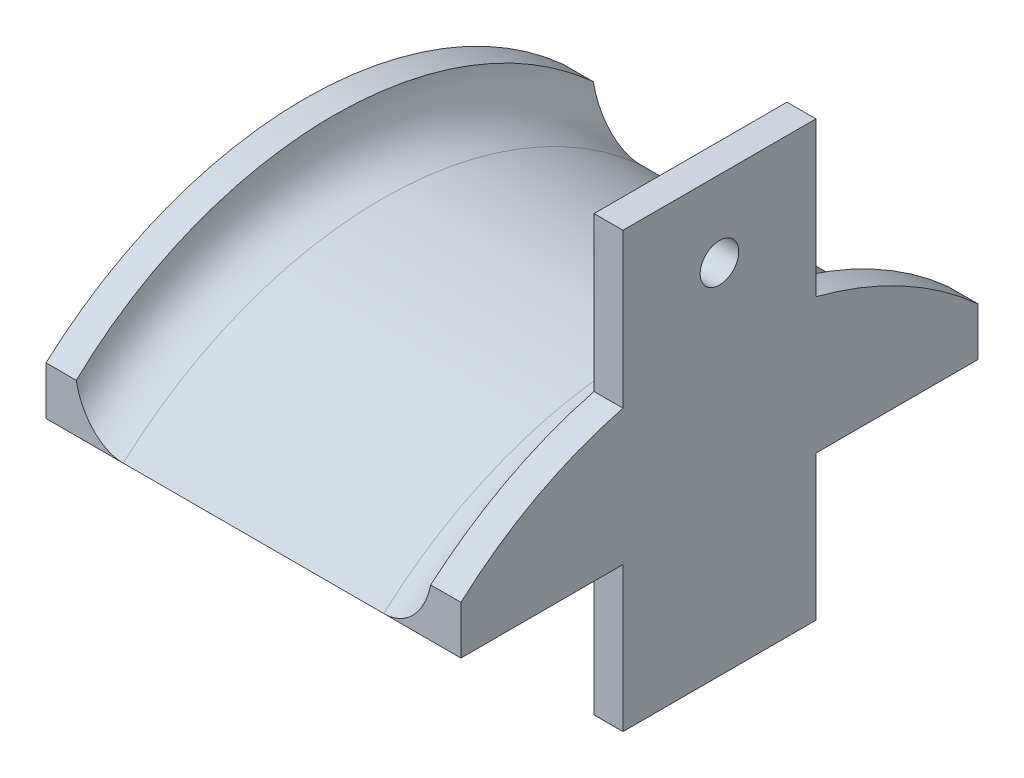
ISO-10303-21;
HEADER;
FILE_DESCRIPTION(('STEP AP214'),'2;1');
FILE_NAME('part.step','',(''),(''),'','','');
FILE_SCHEMA(('AUTOMOTIVE_DESIGN { 1 0 10303 214 1 1 1 1 }'));
ENDSEC;
DATA;
#1=APPLICATION_CONTEXT('core data for automotive mechanical design processes');
#2=APPLICATION_PROTOCOL_DEFINITION('international standard','automotive_design',2000,#1);
#3=PRODUCT_CONTEXT('',#1,'mechanical');
#4=PRODUCT('Part','Part','',(#3));
#5=PRODUCT_RELATED_PRODUCT_CATEGORY('part','',(#4));
#6=PRODUCT_DEFINITION_FORMATION('','',#4);
#7=PRODUCT_DEFINITION_CONTEXT('part definition',#1,'design');
#8=PRODUCT_DEFINITION('design','',#6,#7);
#9=PRODUCT_DEFINITION_SHAPE('','',#8);
#10=(LENGTH_UNIT() NAMED_UNIT(*) SI_UNIT(.MILLI.,.METRE.));
#11=(NAMED_UNIT(*) PLANE_ANGLE_UNIT() SI_UNIT($,.RADIAN.));
#12=(NAMED_UNIT(*) SI_UNIT($,.STERADIAN.) SOLID_ANGLE_UNIT());
#13=UNCERTAINTY_MEASURE_WITH_UNIT(LENGTH_MEASURE(1.E-05),#10,'distance_accuracy_value','');
#14=(GEOMETRIC_REPRESENTATION_CONTEXT(3) GLOBAL_UNCERTAINTY_ASSIGNED_CONTEXT((#13)) GLOBAL_UNIT_ASSIGNED_CONTEXT((#10,
#11,#12)) REPRESENTATION_CONTEXT('',''));
#15=CARTESIAN_POINT('',(0.,0.,0.));
#16=DIRECTION('',(0.,0.,1.));
#17=DIRECTION('',(1.,0.,0.));
#18=AXIS2_PLACEMENT_3D('',#15,#16,#17);
#19=CARTESIAN_POINT('',(37.,29.6991062873225,26.7948331910153));
#20=DIRECTION('',(0.,1.,0.));
#21=DIRECTION('',(0.,0.,1.));
#22=AXIS2_PLACEMENT_3D('',#19,#20,#21);
#23=PLANE('',#22);
#24=DIRECTION('',(-1.,0.,0.));
#25=VECTOR('',#24,1.);
#26=CARTESIAN_POINT('',(18.5,29.6991062873225,-3.));
#27=LINE('',#26,#25);
#28=CARTESIAN_POINT('',(37.,29.6991062873225,-3.));
#29=VERTEX_POINT('',#28);
#30=CARTESIAN_POINT('',(18.5,29.6991062873225,-3.));
#31=VERTEX_POINT('',#30);
#32=EDGE_CURVE('E229',#29,#31,#27,.T.);
#33=ORIENTED_EDGE('',*,*,#32,.T.);
#34=DIRECTION('',(0.,0.,1.));
#35=VECTOR('',#34,1.);
#36=CARTESIAN_POINT('',(18.5,29.6991062873225,-3.));
#37=LINE('',#36,#35);
#38=CARTESIAN_POINT('',(18.5,29.6991062873225,3.));
#39=VERTEX_POINT('',#38);
#40=EDGE_CURVE('E232',#31,#39,#37,.T.);
#41=ORIENTED_EDGE('',*,*,#40,.T.);
#42=DIRECTION('',(-1.,0.,0.));
#43=VECTOR('',#42,1.);
#44=CARTESIAN_POINT('',(18.5,29.6991062873225,3.));
#45=LINE('',#44,#43);
#46=CARTESIAN_POINT('',(37.,29.6991062873225,3.));
#47=VERTEX_POINT('',#46);
#48=EDGE_CURVE('E475',#47,#39,#45,.T.);
#49=ORIENTED_EDGE('',*,*,#48,.F.);
#50=DIRECTION('',(0.,0.,-1.));
#51=VECTOR('',#50,1.);
#52=CARTESIAN_POINT('',(37.,29.6991062873225,26.7948331910153));
#53=LINE('',#52,#51);
#54=CARTESIAN_POINT('',(37.,29.6991062873225,9.99999999999661));
#55=VERTEX_POINT('',#54);
#56=EDGE_CURVE('E346',#55,#47,#53,.T.);
#57=ORIENTED_EDGE('',*,*,#56,.F.);
#58=DIRECTION('',(-1.,0.,0.));
#59=VECTOR('',#58,1.);
#60=CARTESIAN_POINT('',(40.,29.6991062873225,9.99999999999661));
#61=LINE('',#60,#59);
#62=CARTESIAN_POINT('',(40.,29.6991062873225,9.99999999999661));
#63=VERTEX_POINT('',#62);
#64=EDGE_CURVE('E319',#63,#55,#61,.T.);
#65=ORIENTED_EDGE('',*,*,#64,.F.);
#66=DIRECTION('',(0.,0.,-1.));
#67=VECTOR('',#66,1.);
#68=CARTESIAN_POINT('',(40.,29.6991062873225,26.7948331910153));
#69=LINE('',#68,#67);
#70=CARTESIAN_POINT('',(40.,29.6991062873225,26.7948331910153));
#71=VERTEX_POINT('',#70);
#72=EDGE_CURVE('E252',#71,#63,#69,.T.);
#73=ORIENTED_EDGE('',*,*,#72,.F.);
#74=DIRECTION('',(-1.,0.,0.));
#75=VECTOR('',#74,1.);
#76=CARTESIAN_POINT('',(40.,29.6991062873225,26.7948331910153));
#77=LINE('',#76,#75);
#78=CARTESIAN_POINT('',(32.,29.6991062873225,26.7948331910153));
#79=VERTEX_POINT('',#78);
#80=EDGE_CURVE('E125',#71,#79,#77,.T.);
#81=ORIENTED_EDGE('',*,*,#80,.T.);
#82=DIRECTION('',(-1.,0.,0.));
#83=VECTOR('',#82,1.);
#84=CARTESIAN_POINT('',(37.,29.6991062873225,26.7948331910153));
#85=LINE('',#84,#83);
#86=CARTESIAN_POINT('',(5.,29.6991062873225,26.7948331910153));
#87=VERTEX_POINT('',#86);
#88=EDGE_CURVE('E399',#79,#87,#85,.T.);
#89=ORIENTED_EDGE('',*,*,#88,.T.);
#90=DIRECTION('',(1.,0.,0.));
#91=VECTOR('',#90,1.);
#92=CARTESIAN_POINT('',(-3.,29.6991062873225,26.7948331910153));
#93=LINE('',#92,#91);
#94=CARTESIAN_POINT('',(-3.,29.6991062873225,26.7948331910153));
#95=VERTEX_POINT('',#94);
#96=EDGE_CURVE('E338',#95,#87,#93,.T.);
#97=ORIENTED_EDGE('',*,*,#96,.F.);
#98=DIRECTION('',(0.,0.,1.));
#99=VECTOR('',#98,1.);
#100=CARTESIAN_POINT('',(-3.,29.6991062873225,-26.7948331910151));
#101=LINE('',#100,#99);
#102=CARTESIAN_POINT('',(-3.,29.6991062873225,-26.7948331910151));
#103=VERTEX_POINT('',#102);
#104=EDGE_CURVE('E320',#103,#95,#101,.T.);
#105=ORIENTED_EDGE('',*,*,#104,.F.);
#106=DIRECTION('',(1.,0.,0.));
#107=VECTOR('',#106,1.);
#108=CARTESIAN_POINT('',(-3.,29.6991062873225,-26.7948331910151));
#109=LINE('',#108,#107);
#110=CARTESIAN_POINT('',(5.,29.6991062873225,-26.7948331910151));
#111=VERTEX_POINT('',#110);
#112=EDGE_CURVE('E332',#103,#111,#109,.T.);
#113=ORIENTED_EDGE('',*,*,#112,.T.);
#114=DIRECTION('',(-1.,0.,0.));
#115=VECTOR('',#114,1.);
#116=CARTESIAN_POINT('',(37.,29.6991062873225,-26.7948331910151));
#117=LINE('',#116,#115);
#118=CARTESIAN_POINT('',(32.,29.6991062873225,-26.7948331910151));
#119=VERTEX_POINT('',#118);
#120=EDGE_CURVE('E342',#119,#111,#117,.T.);
#121=ORIENTED_EDGE('',*,*,#120,.F.);
#122=DIRECTION('',(-1.,0.,0.));
#123=VECTOR('',#122,1.);
#124=CARTESIAN_POINT('',(40.,29.6991062873225,-26.7948331910151));
#125=LINE('',#124,#123);
#126=CARTESIAN_POINT('',(40.,29.6991062873225,-26.7948331910151));
#127=VERTEX_POINT('',#126);
#128=EDGE_CURVE('E83',#127,#119,#125,.T.);
#129=ORIENTED_EDGE('',*,*,#128,.F.);
#130=DIRECTION('',(0.,0.,-1.));
#131=VECTOR('',#130,1.);
#132=CARTESIAN_POINT('',(40.,29.6991062873225,-9.9999999999964));
#133=LINE('',#132,#131);
#134=CARTESIAN_POINT('',(40.,29.6991062873225,-9.9999999999964));
#135=VERTEX_POINT('',#134);
#136=EDGE_CURVE('E265',#135,#127,#133,.T.);
#137=ORIENTED_EDGE('',*,*,#136,.F.);
#138=DIRECTION('',(-1.,0.,0.));
#139=VECTOR('',#138,1.);
#140=CARTESIAN_POINT('',(40.,29.6991062873225,-9.9999999999964));
#141=LINE('',#140,#139);
#142=CARTESIAN_POINT('',(37.,29.6991062873225,-9.99999999999646));
#143=VERTEX_POINT('',#142);
#144=EDGE_CURVE('E312',#135,#143,#141,.T.);
#145=ORIENTED_EDGE('',*,*,#144,.T.);
#146=EDGE_CURVE('E236',#29,#143,#53,.T.);
#147=ORIENTED_EDGE('',*,*,#146,.F.);
#148=EDGE_LOOP('',(#33,#41,#49,#57,#65,#73,#81,#89,#97,#105,#113,#121,#129,#137,#145,#147));
#149=FACE_BOUND('',#148,.T.);
#150=ADVANCED_FACE('F32',(#149),#23,.F.);
#151=CARTESIAN_POINT('',(37.,5.,0.));
#152=DIRECTION('',(1.,0.,0.));
#153=DIRECTION('',(0.,0.,-1.));
#154=AXIS2_PLACEMENT_3D('',#151,#152,#153);
#155=PLANE('',#154);
#156=DIRECTION('',(0.,1.,0.));
#157=VECTOR('',#156,1.);
#158=CARTESIAN_POINT('',(37.,29.6991062873225,-3.));
#159=LINE('',#158,#157);
#160=CARTESIAN_POINT('',(37.,14.6991062873225,-3.));
#161=VERTEX_POINT('',#160);
#162=EDGE_CURVE('E241',#161,#29,#159,.T.);
#163=ORIENTED_EDGE('',*,*,#162,.T.);
#164=ORIENTED_EDGE('',*,*,#146,.T.);
#165=DIRECTION('',(0.,1.,0.));
#166=VECTOR('',#165,1.);
#167=CARTESIAN_POINT('',(37.,29.6991062873225,-9.9999999999964));
#168=LINE('',#167,#166);
#169=CARTESIAN_POINT('',(37.,14.6991062873225,-9.9999999999965));
#170=VERTEX_POINT('',#169);
#171=EDGE_CURVE('E290',#170,#143,#168,.T.);
#172=ORIENTED_EDGE('',*,*,#171,.F.);
#173=DIRECTION('',(0.,0.,-1.));
#174=VECTOR('',#173,1.);
#175=CARTESIAN_POINT('',(37.,14.6991062873225,9.99999999999661));
#176=LINE('',#175,#174);
#177=EDGE_CURVE('E291',#161,#170,#176,.T.);
#178=ORIENTED_EDGE('',*,*,#177,.F.);
#179=EDGE_LOOP('',(#163,#164,#172,#178));
#180=FACE_BOUND('',#179,.T.);
#181=ADVANCED_FACE('F217',(#180),#155,.F.);
#182=CARTESIAN_POINT('',(37.,0.,0.));
#183=DIRECTION('',(-1.,0.,0.));
#184=DIRECTION('',(0.,0.,1.));
#185=AXIS2_PLACEMENT_3D('',#182,#183,#184);
#186=CYLINDRICAL_SURFACE('',#185,40.0000000000001);
#187=ORIENTED_EDGE('',*,*,#120,.T.);
#188=CARTESIAN_POINT('',(5.,0.,0.));
#189=DIRECTION('',(-1.,0.,0.));
#190=DIRECTION('',(0.,0.,1.));
#191=AXIS2_PLACEMENT_3D('',#188,#189,#190);
#192=CIRCLE('',#191,40.0000000000001);
#193=EDGE_CURVE('E406',#111,#87,#192,.F.);
#194=ORIENTED_EDGE('',*,*,#193,.T.);
#195=ORIENTED_EDGE('',*,*,#88,.F.);
#196=CARTESIAN_POINT('',(32.,0.,0.));
#197=DIRECTION('',(1.,0.,0.));
#198=DIRECTION('',(0.,0.,-1.));
#199=AXIS2_PLACEMENT_3D('',#196,#197,#198);
#200=CIRCLE('',#199,40.0000000000001);
#201=EDGE_CURVE('E132',#79,#119,#200,.F.);
#202=ORIENTED_EDGE('',*,*,#201,.T.);
#203=EDGE_LOOP('',(#187,#194,#195,#202));
#204=FACE_BOUND('',#203,.T.);
#205=ADVANCED_FACE('F191',(#204),#186,.T.);
#206=CARTESIAN_POINT('',(-3.,29.6991062873225,26.7948331910153));
#207=DIRECTION('',(0.,0.,-1.));
#208=DIRECTION('',(-1.,0.,0.));
#209=AXIS2_PLACEMENT_3D('',#206,#207,#208);
#210=PLANE('',#209);
#211=ORIENTED_EDGE('',*,*,#96,.T.);
#212=CARTESIAN_POINT('',(5.,29.6991062873225,26.7948331910153));
#213=CARTESIAN_POINT('',(4.883608827279,29.699065144692,26.7948331910153));
#214=CARTESIAN_POINT('',(4.76723671339743,29.704578128879,26.7948331910153));
#215=CARTESIAN_POINT('',(4.53559413910091,29.7264015282942,26.7948331910153));
#216=CARTESIAN_POINT('',(4.42032291824739,29.7427038463364,26.7948331910153));
#217=CARTESIAN_POINT('',(4.19268571822621,29.7856229590139,26.7948331910153));
#218=CARTESIAN_POINT('',(4.08030384430398,29.8121558927056,26.7948331910153));
#219=CARTESIAN_POINT('',(3.85830574869846,29.8750072741677,26.7948331910153));
#220=CARTESIAN_POINT('',(3.74868991286835,29.9113270790114,26.7948331910153));
#221=CARTESIAN_POINT('',(3.53325649871711,29.9929782472657,26.7948331910153));
#222=CARTESIAN_POINT('',(3.42742842586452,30.0382819952286,26.7948331910153));
#223=CARTESIAN_POINT('',(3.21973871615944,30.137252256486,26.7948331910153));
#224=CARTESIAN_POINT('',(3.11787862346508,30.1909219855975,26.7948331910153));
#225=CARTESIAN_POINT('',(2.81861121944211,30.3635318057687,26.7948331910153));
#226=CARTESIAN_POINT('',(2.62776184707359,30.4939771506646,26.7948331910153));
#227=CARTESIAN_POINT('',(2.19717036265739,30.8337015452245,26.7948331910153));
#228=CARTESIAN_POINT('',(1.96627600665766,31.0541287262231,26.7948331910153));
#229=CARTESIAN_POINT('',(1.54301489497937,31.5294801875637,26.7948331910153));
#230=CARTESIAN_POINT('',(1.35073164028924,31.7844772775766,26.7948331910153));
#231=CARTESIAN_POINT('',(0.957538397866947,32.3921846894286,26.7948331910153));
#232=CARTESIAN_POINT('',(0.768548306610147,32.7525899784403,26.7948331910153));
#233=CARTESIAN_POINT('',(0.452230658854511,33.4986489004537,26.7948331910153));
#234=CARTESIAN_POINT('',(0.324818607885212,33.884267107355,26.7948331910153));
#235=CARTESIAN_POINT('',(0.193572322569176,34.416915500635,26.7948331910153));
#236=CARTESIAN_POINT('',(0.162993538860503,34.5576844509203,26.7948331910153));
#237=CARTESIAN_POINT('',(0.136297432508185,34.6991062873224,26.7948331910153));
#238=B_SPLINE_CURVE_WITH_KNOTS('',3,(#212,#213,#214,#215,#216,#217,#218,#219,#220,#221,#222,
#223,#224,#225,#226,#227,#228,#229,#230,#231,#232,#233,#234,#235,#236,#237),.UNSPECIFIED.,.F.,
.F.,(4,2,2,2,2,2,2,2,2,2,2,2,4),(0.,0.349012948225263,0.697764265564161,1.04371562066314,
1.38971497099414,1.73466680620642,2.0797515666588,2.77070121334702,3.72326309347063,
4.67786332391619,5.89251713906917,7.10549949815716,7.53740503174517),.UNSPECIFIED.);
#239=CARTESIAN_POINT('',(0.136297432508184,34.6991062873224,26.7948331910152));
#240=VERTEX_POINT('',#239);
#241=EDGE_CURVE('E196',#87,#240,#238,.T.);
#242=ORIENTED_EDGE('',*,*,#241,.T.);
#243=DIRECTION('',(1.,0.,0.));
#244=VECTOR('',#243,1.);
#245=CARTESIAN_POINT('',(-3.,34.6991062873224,26.7948331910152));
#246=LINE('',#245,#244);
#247=CARTESIAN_POINT('',(-3.,34.6991062873224,26.7948331910152));
#248=VERTEX_POINT('',#247);
#249=EDGE_CURVE('E336',#248,#240,#246,.T.);
#250=ORIENTED_EDGE('',*,*,#249,.F.);
#251=DIRECTION('',(0.,1.,0.));
#252=VECTOR('',#251,1.);
#253=CARTESIAN_POINT('',(-3.,29.6991062873225,26.7948331910153));
#254=LINE('',#253,#252);
#255=EDGE_CURVE('E323',#95,#248,#254,.T.);
#256=ORIENTED_EDGE('',*,*,#255,.F.);
#257=EDGE_LOOP('',(#211,#242,#250,#256));
#258=FACE_BOUND('',#257,.T.);
#259=ADVANCED_FACE('F210',(#258),#210,.F.);
#260=CARTESIAN_POINT('',(-3.,5.,0.));
#261=DIRECTION('',(1.,0.,0.));
#262=DIRECTION('',(0.,0.,-1.));
#263=AXIS2_PLACEMENT_3D('',#260,#261,#262);
#264=CYLINDRICAL_SURFACE('',#263,40.0000000000001);
#265=CARTESIAN_POINT('',(0.136297432508184,34.6991062873224,26.7948331910153));
#266=CARTESIAN_POINT('',(0.120981691424066,35.2627875997258,26.1701108468965));
#267=CARTESIAN_POINT('',(0.107563574766574,35.8067161177527,25.5275366555413));
#268=CARTESIAN_POINT('',(0.0839633679317195,36.8529351001697,24.2094526936563));
#269=CARTESIAN_POINT('',(0.0737807560068713,37.3552322682365,23.533948253641));
#270=CARTESIAN_POINT('',(0.0560710237777471,38.3171481362605,22.1512622104354));
#271=CARTESIAN_POINT('',(0.0485489625995903,38.7766843155595,21.444023108501));
#272=CARTESIAN_POINT('',(0.0356856104183543,39.6502114316604,20.0018444592444));
#273=CARTESIAN_POINT('',(0.0303446400247021,40.0641956660252,19.2669008568305));
#274=CARTESIAN_POINT('',(0.0198885889012127,40.975293680572,17.5226354998639));
#275=CARTESIAN_POINT('',(0.015444299561232,41.454014419151,16.5036318131745));
#276=CARTESIAN_POINT('',(0.00866725032493233,42.32397956311,14.4286749898395));
#277=CARTESIAN_POINT('',(0.0063350739298912,42.715199772758,13.3727117262181));
#278=CARTESIAN_POINT('',(0.00299667393343831,43.4069206467483,11.2326288280633));
#279=CARTESIAN_POINT('',(0.00198917385492851,43.7075084301674,10.1485373273046));
#280=CARTESIAN_POINT('',(0.000679046006653607,44.2162320119374,7.95921449845588));
#281=CARTESIAN_POINT('',(0.000376104288077239,44.4244089547718,6.85399280734312));
#282=CARTESIAN_POINT('',(0.000141990425087872,44.6546896974295,5.2665853741317));
#283=CARTESIAN_POINT('',(9.7281479076836E-05,44.7151104345637,4.78969222624584));
#284=CARTESIAN_POINT('',(3.69428240319359E-05,44.8187170376224,3.8341287191855));
#285=CARTESIAN_POINT('',(2.13064971440976E-05,44.8619068241014,3.35545878932732));
#286=CARTESIAN_POINT('',(-2.87128655328331E-06,44.9654547634259,1.91920569190799));
#287=CARTESIAN_POINT('',(1.11834398638669E-05,45.000034861475,0.959699175969698));
#288=CARTESIAN_POINT('',(0.,45.0000000000001,0.));
#289=B_SPLINE_CURVE_WITH_KNOTS('',3,(#265,#266,#267,#268,#269,#270,#271,#272,#273,#274,#275,
#276,#277,#278,#279,#280,#281,#282,#283,#284,#285,#286,#287,#288),.UNSPECIFIED.,.F.,.F.,(4,2,2,
2,2,2,2,2,2,2,2,4),(0.,2.52428428514874,5.0481613051965,7.57681208184856,10.1058344238273,
13.4792348155897,16.8535668732098,20.2246449872251,23.5942206722455,25.0360927891892,
26.4776366499183,29.3556443419373),.UNSPECIFIED.);
#290=CARTESIAN_POINT('',(0.,45.0000000000001,0.));
#291=VERTEX_POINT('',#290);
#292=EDGE_CURVE('E203',#240,#291,#289,.T.);
#293=ORIENTED_EDGE('',*,*,#292,.T.);
#294=CARTESIAN_POINT('',(0.,45.0000000000001,0.));
#295=CARTESIAN_POINT('',(1.11328022126792E-05,45.0000366437522,-0.841529904533736));
#296=CARTESIAN_POINT('',(3.59424388965789E-07,44.9734446126755,-1.68305016209391));
#297=CARTESIAN_POINT('',(1.53037891953739E-05,44.8672800155057,-3.36261045927914));
#298=CARTESIAN_POINT('',(4.10158239596279E-05,44.7877157375523,-4.20065102270684));
#299=CARTESIAN_POINT('',(0.000209349919230699,44.5756790163419,-5.87166630578954));
#300=CARTESIAN_POINT('',(0.000352197375627464,44.4431048218482,-6.70462813702892));
#301=CARTESIAN_POINT('',(0.000914717947897093,44.1255858986403,-8.36059136060547));
#302=CARTESIAN_POINT('',(0.00133443138277733,43.9406335445202,-9.18359128444657));
#303=CARTESIAN_POINT('',(0.00288409589048187,43.4486585778303,-11.0889636447383));
#304=CARTESIAN_POINT('',(0.00420437864908869,43.1214968207948,-12.1662005700819));
#305=CARTESIAN_POINT('',(0.00837919498684742,42.3774810934726,-14.2895045632555));
#306=CARTESIAN_POINT('',(0.011234152599991,41.9606023532873,-15.3355629320322));
#307=CARTESIAN_POINT('',(0.0193127326729199,41.0406466868227,-17.3877871346204));
#308=CARTESIAN_POINT('',(0.0245340190692579,40.5376550760366,-18.3939912501944));
#309=CARTESIAN_POINT('',(0.0383354328830063,39.4488888131617,-20.3601527233737));
#310=CARTESIAN_POINT('',(0.0469140585328234,38.8631512488269,-21.3201305430956));
#311=CARTESIAN_POINT('',(0.0623758269978372,37.970819726919,-22.6529563408328));
#312=CARTESIAN_POINT('',(0.0674219527586263,37.6962017130538,-23.0475504239682));
#313=CARTESIAN_POINT('',(0.078436805950915,37.1329825705231,-23.8265027952839));
#314=CARTESIAN_POINT('',(0.0844053228213679,36.8443846434528,-24.2108633961209));
#315=CARTESIAN_POINT('',(0.103832473253642,35.9591067076028,-25.3466917228591));
#316=CARTESIAN_POINT('',(0.118828130715077,35.3420082446609,-26.0823008449339));
#317=CARTESIAN_POINT('',(0.136297432508167,34.6991062873226,-26.7948331910151));
#318=B_SPLINE_CURVE_WITH_KNOTS('',3,(#294,#295,#296,#297,#298,#299,#300,#301,#302,#303,#304,
#305,#306,#307,#308,#309,#310,#311,#312,#313,#314,#315,#316,#317),.UNSPECIFIED.,.F.,.F.,(4,2,2,
2,2,2,2,2,2,2,2,4),(0.,2.52415273608526,5.04791063116635,7.57653625299124,10.1055301908849,
13.4788190885455,16.8530405126841,20.2239381032941,23.5933295817729,25.0354107982252,
26.4771633050603,29.3556441183064),.UNSPECIFIED.);
#319=CARTESIAN_POINT('',(0.13629743250818,34.6991062873225,-26.7948331910151));
#320=VERTEX_POINT('',#319);
#321=EDGE_CURVE('E177',#291,#320,#318,.T.);
#322=ORIENTED_EDGE('',*,*,#321,.T.);
#323=DIRECTION('',(1.,0.,0.));
#324=VECTOR('',#323,1.);
#325=CARTESIAN_POINT('',(-3.,34.6991062873225,-26.7948331910151));
#326=LINE('',#325,#324);
#327=CARTESIAN_POINT('',(-3.,34.6991062873225,-26.7948331910151));
#328=VERTEX_POINT('',#327);
#329=EDGE_CURVE('E334',#328,#320,#326,.T.);
#330=ORIENTED_EDGE('',*,*,#329,.F.);
#331=CARTESIAN_POINT('',(-3.,5.,0.));
#332=DIRECTION('',(-1.,0.,0.));
#333=DIRECTION('',(0.,0.,1.));
#334=AXIS2_PLACEMENT_3D('',#331,#332,#333);
#335=CIRCLE('',#334,40.0000000000001);
#336=EDGE_CURVE('E326',#248,#328,#335,.T.);
#337=ORIENTED_EDGE('',*,*,#336,.F.);
#338=ORIENTED_EDGE('',*,*,#249,.T.);
#339=EDGE_LOOP('',(#293,#322,#330,#337,#338));
#340=FACE_BOUND('',#339,.T.);
#341=ADVANCED_FACE('F207',(#340),#264,.T.);
#342=CARTESIAN_POINT('',(-3.,34.6991062873225,-26.7948331910151));
#343=DIRECTION('',(0.,0.,1.));
#344=DIRECTION('',(1.,0.,0.));
#345=AXIS2_PLACEMENT_3D('',#342,#343,#344);
#346=PLANE('',#345);
#347=ORIENTED_EDGE('',*,*,#329,.T.);
#348=CARTESIAN_POINT('',(0.13629743250818,34.6991062873226,-26.7948331910151));
#349=CARTESIAN_POINT('',(0.175482006095344,34.4915531976735,-26.7948331910151));
#350=CARTESIAN_POINT('',(0.222997900217363,34.2855470889629,-26.7948331910151));
#351=CARTESIAN_POINT('',(0.334744573558803,33.8778852465213,-26.7948331910151));
#352=CARTESIAN_POINT('',(0.398993362599763,33.6762344552821,-26.7948331910151));
#353=CARTESIAN_POINT('',(0.54478607004673,33.2773181906268,-26.7948331910151));
#354=CARTESIAN_POINT('',(0.626471395427485,33.080104099734,-26.7948331910151));
#355=CARTESIAN_POINT('',(0.806837644086512,32.6937515537687,-26.7948331910151));
#356=CARTESIAN_POINT('',(0.905509886232467,32.5046090350455,-26.7948331910151));
#357=CARTESIAN_POINT('',(1.1764861441733,32.039428968776,-26.7948331910151));
#358=CARTESIAN_POINT('',(1.3602495524727,31.7699067398925,-26.7948331910151));
#359=CARTESIAN_POINT('',(1.76785140668994,31.2639298859551,-26.7948331910151));
#360=CARTESIAN_POINT('',(1.99156968955366,31.0273797950871,-26.7948331910151));
#361=CARTESIAN_POINT('',(2.42568854513531,30.6456221745818,-26.7948331910151));
#362=CARTESIAN_POINT('',(2.62837345162299,30.4917419492558,-26.7948331910151));
#363=CARTESIAN_POINT('',(2.94879513919643,30.2872491816607,-26.7948331910151));
#364=CARTESIAN_POINT('',(3.05825588787776,30.2235067879648,-26.7948331910151));
#365=CARTESIAN_POINT('',(3.28224422101942,30.1057032654892,-26.7948331910151));
#366=CARTESIAN_POINT('',(3.3967693798892,30.0516375633817,-26.7948331910151));
#367=CARTESIAN_POINT('',(3.63033444683263,29.9541314565013,-26.7948331910151));
#368=CARTESIAN_POINT('',(3.74937646158962,29.9106960819085,-26.7948331910151));
#369=CARTESIAN_POINT('',(3.99105573863531,29.8353901518701,-26.7948331910151));
#370=CARTESIAN_POINT('',(4.11369228213765,29.8035173011271,-26.7948331910151));
#371=CARTESIAN_POINT('',(4.36283924392298,29.7518177229111,-26.7948331910151));
#372=CARTESIAN_POINT('',(4.48937682356835,29.7321210559851,-26.7948331910151));
#373=CARTESIAN_POINT('',(4.74393182456605,29.7057286475141,-26.7948331910151));
#374=CARTESIAN_POINT('',(4.87195067916092,29.6990467821969,-26.7948331910151));
#375=CARTESIAN_POINT('',(5.00000000000003,29.6991062873226,-26.7948331910151));
#376=B_SPLINE_CURVE_WITH_KNOTS('',3,(#348,#349,#350,#351,#352,#353,#354,#355,#356,#357,#358,
#359,#360,#361,#362,#363,#364,#365,#366,#367,#368,#369,#370,#371,#372,#373,#374,#375),
.UNSPECIFIED.,.F.,.F.,(4,2,2,2,2,2,2,2,2,2,2,2,2,4),(0.,0.633524522422574,1.26773375351177,
1.9072962095455,2.54653278340021,3.52138459287775,4.49335247793362,5.2535821504044,
5.63318831656478,6.01261459953256,6.39222007813864,6.77175015928625,7.15526716491822,
7.53919284850803),.UNSPECIFIED.);
#377=EDGE_CURVE('E170',#320,#111,#376,.T.);
#378=ORIENTED_EDGE('',*,*,#377,.T.);
#379=ORIENTED_EDGE('',*,*,#112,.F.);
#380=DIRECTION('',(0.,-1.,0.));
#381=VECTOR('',#380,1.);
#382=CARTESIAN_POINT('',(-3.,34.6991062873225,-26.7948331910151));
#383=LINE('',#382,#381);
#384=EDGE_CURVE('E329',#328,#103,#383,.T.);
#385=ORIENTED_EDGE('',*,*,#384,.F.);
#386=EDGE_LOOP('',(#347,#378,#379,#385));
#387=FACE_BOUND('',#386,.T.);
#388=ADVANCED_FACE('F183',(#387),#346,.F.);
#389=CARTESIAN_POINT('',(-3.,5.,0.));
#390=DIRECTION('',(-1.,0.,0.));
#391=DIRECTION('',(0.,0.,1.));
#392=AXIS2_PLACEMENT_3D('',#389,#390,#391);
#393=PLANE('',#392);
#394=ORIENTED_EDGE('',*,*,#104,.T.);
#395=ORIENTED_EDGE('',*,*,#255,.T.);
#396=ORIENTED_EDGE('',*,*,#336,.T.);
#397=ORIENTED_EDGE('',*,*,#384,.T.);
#398=EDGE_LOOP('',(#394,#395,#396,#397));
#399=FACE_BOUND('',#398,.T.);
#400=ADVANCED_FACE('F377',(#399),#393,.T.);
#401=CARTESIAN_POINT('',(37.,51.786964112142,2.0643209364124E-13));
#402=DIRECTION('',(-1.,0.,0.));
#403=DIRECTION('',(0.,0.,1.));
#404=AXIS2_PLACEMENT_3D('',#401,#402,#403);
#405=CIRCLE('',#404,2.);
#406=CARTESIAN_POINT('',(37.,51.786964112142,2.00000000000021));
#407=VERTEX_POINT('',#406);
#408=EDGE_CURVE('E681',#407,#407,#405,.T.);
#409=ORIENTED_EDGE('',*,*,#408,.F.);
#410=EDGE_LOOP('',(#409));
#411=FACE_BOUND('',#410,.T.);
#412=DIRECTION('',(0.,1.,0.));
#413=VECTOR('',#412,1.);
#414=CARTESIAN_POINT('',(37.,59.6991062873225,-9.9999999999962));
#415=LINE('',#414,#413);
#416=CARTESIAN_POINT('',(37.,43.8748219369615,-9.9999999999963));
#417=VERTEX_POINT('',#416);
#418=CARTESIAN_POINT('',(37.,59.6991062873225,-9.9999999999962));
#419=VERTEX_POINT('',#418);
#420=EDGE_CURVE('E292',#417,#419,#415,.T.);
#421=ORIENTED_EDGE('',*,*,#420,.F.);
#422=CARTESIAN_POINT('',(37.,0.,0.));
#423=DIRECTION('',(1.,0.,0.));
#424=DIRECTION('',(0.,0.,-1.));
#425=AXIS2_PLACEMENT_3D('',#422,#423,#424);
#426=CIRCLE('',#425,45.0000000000001);
#427=CARTESIAN_POINT('',(37.,43.8748219369615,9.99999999999661));
#428=VERTEX_POINT('',#427);
#429=EDGE_CURVE('E408',#417,#428,#426,.T.);
#430=ORIENTED_EDGE('',*,*,#429,.T.);
#431=DIRECTION('',(0.,-1.,0.));
#432=VECTOR('',#431,1.);
#433=CARTESIAN_POINT('',(37.,59.6991062873225,9.99999999999661));
#434=LINE('',#433,#432);
#435=CARTESIAN_POINT('',(37.,59.6991062873225,9.99999999999661));
#436=VERTEX_POINT('',#435);
#437=EDGE_CURVE('E256',#436,#428,#434,.T.);
#438=ORIENTED_EDGE('',*,*,#437,.F.);
#439=DIRECTION('',(0.,0.,1.));
#440=VECTOR('',#439,1.);
#441=CARTESIAN_POINT('',(37.,59.6991062873225,9.99999999999661));
#442=LINE('',#441,#440);
#443=EDGE_CURVE('E295',#419,#436,#442,.T.);
#444=ORIENTED_EDGE('',*,*,#443,.F.);
#445=EDGE_LOOP('',(#421,#430,#438,#444));
#446=FACE_BOUND('',#445,.T.);
#447=ADVANCED_FACE('F154',(#411,#446),#155,.F.);
#448=ORIENTED_EDGE('',*,*,#56,.T.);
#449=DIRECTION('',(0.,1.,0.));
#450=VECTOR('',#449,1.);
#451=CARTESIAN_POINT('',(37.,29.6991062873225,3.));
#452=LINE('',#451,#450);
#453=CARTESIAN_POINT('',(37.,14.6991062873225,3.));
#454=VERTEX_POINT('',#453);
#455=EDGE_CURVE('E683',#454,#47,#452,.T.);
#456=ORIENTED_EDGE('',*,*,#455,.F.);
#457=CARTESIAN_POINT('',(37.,14.6991062873225,9.99999999999661));
#458=VERTEX_POINT('',#457);
#459=EDGE_CURVE('E287',#458,#454,#176,.T.);
#460=ORIENTED_EDGE('',*,*,#459,.F.);
#461=DIRECTION('',(0.,-1.,0.));
#462=VECTOR('',#461,1.);
#463=CARTESIAN_POINT('',(37.,29.6991062873225,9.99999999999661));
#464=LINE('',#463,#462);
#465=EDGE_CURVE('E250',#55,#458,#464,.T.);
#466=ORIENTED_EDGE('',*,*,#465,.F.);
#467=EDGE_LOOP('',(#448,#456,#460,#466));
#468=FACE_BOUND('',#467,.T.);
#469=ADVANCED_FACE('F223',(#468),#155,.F.);
#470=CARTESIAN_POINT('',(40.,29.6991062873225,9.99999999999661));
#471=DIRECTION('',(0.,0.,-1.));
#472=DIRECTION('',(0.,1.,0.));
#473=AXIS2_PLACEMENT_3D('',#470,#471,#472);
#474=PLANE('',#473);
#475=ORIENTED_EDGE('',*,*,#465,.T.);
#476=DIRECTION('',(-1.,0.,0.));
#477=VECTOR('',#476,1.);
#478=CARTESIAN_POINT('',(40.,14.6991062873225,9.99999999999661));
#479=LINE('',#478,#477);
#480=CARTESIAN_POINT('',(40.,14.6991062873225,9.99999999999661));
#481=VERTEX_POINT('',#480);
#482=EDGE_CURVE('E316',#481,#458,#479,.T.);
#483=ORIENTED_EDGE('',*,*,#482,.F.);
#484=DIRECTION('',(0.,-1.,0.));
#485=VECTOR('',#484,1.);
#486=CARTESIAN_POINT('',(40.,29.6991062873225,9.99999999999661));
#487=LINE('',#486,#485);
#488=EDGE_CURVE('E255',#63,#481,#487,.T.);
#489=ORIENTED_EDGE('',*,*,#488,.F.);
#490=ORIENTED_EDGE('',*,*,#64,.T.);
#491=EDGE_LOOP('',(#475,#483,#489,#490));
#492=FACE_BOUND('',#491,.T.);
#493=ADVANCED_FACE('F373',(#492),#474,.F.);
#494=CARTESIAN_POINT('',(40.,14.6991062873225,9.99999999999661));
#495=DIRECTION('',(0.,1.,0.));
#496=DIRECTION('',(0.,0.,1.));
#497=AXIS2_PLACEMENT_3D('',#494,#495,#496);
#498=PLANE('',#497);
#499=ORIENTED_EDGE('',*,*,#459,.T.);
#500=DIRECTION('',(0.,0.,1.));
#501=VECTOR('',#500,1.);
#502=CARTESIAN_POINT('',(37.,14.6991062873225,-3.));
#503=LINE('',#502,#501);
#504=EDGE_CURVE('E248',#161,#454,#503,.T.);
#505=ORIENTED_EDGE('',*,*,#504,.F.);
#506=ORIENTED_EDGE('',*,*,#177,.T.);
#507=DIRECTION('',(-1.,0.,0.));
#508=VECTOR('',#507,1.);
#509=CARTESIAN_POINT('',(40.,14.6991062873225,-9.9999999999965));
#510=LINE('',#509,#508);
#511=CARTESIAN_POINT('',(40.,14.6991062873225,-9.9999999999965));
#512=VERTEX_POINT('',#511);
#513=EDGE_CURVE('E313',#512,#170,#510,.T.);
#514=ORIENTED_EDGE('',*,*,#513,.F.);
#515=DIRECTION('',(0.,0.,-1.));
#516=VECTOR('',#515,1.);
#517=CARTESIAN_POINT('',(40.,14.6991062873225,9.99999999999661));
#518=LINE('',#517,#516);
#519=EDGE_CURVE('E259',#481,#512,#518,.T.);
#520=ORIENTED_EDGE('',*,*,#519,.F.);
#521=ORIENTED_EDGE('',*,*,#482,.T.);
#522=EDGE_LOOP('',(#499,#505,#506,#514,#520,#521));
#523=FACE_BOUND('',#522,.T.);
#524=ADVANCED_FACE('F369',(#523),#498,.F.);
#525=CARTESIAN_POINT('',(40.,29.6991062873225,-9.9999999999964));
#526=DIRECTION('',(0.,0.,1.));
#527=DIRECTION('',(0.,-1.,0.));
#528=AXIS2_PLACEMENT_3D('',#525,#526,#527);
#529=PLANE('',#528);
#530=ORIENTED_EDGE('',*,*,#171,.T.);
#531=ORIENTED_EDGE('',*,*,#144,.F.);
#532=DIRECTION('',(0.,1.,0.));
#533=VECTOR('',#532,1.);
#534=CARTESIAN_POINT('',(40.,29.6991062873225,-9.9999999999964));
#535=LINE('',#534,#533);
#536=EDGE_CURVE('E262',#512,#135,#535,.T.);
#537=ORIENTED_EDGE('',*,*,#536,.F.);
#538=ORIENTED_EDGE('',*,*,#513,.T.);
#539=EDGE_LOOP('',(#530,#531,#537,#538));
#540=FACE_BOUND('',#539,.T.);
#541=ADVANCED_FACE('F366',(#540),#529,.F.);
#542=CARTESIAN_POINT('',(40.,29.6991062873225,-26.7948331910151));
#543=DIRECTION('',(0.,0.,1.));
#544=DIRECTION('',(1.,0.,0.));
#545=AXIS2_PLACEMENT_3D('',#542,#543,#544);
#546=PLANE('',#545);
#547=ORIENTED_EDGE('',*,*,#128,.T.);
#548=CARTESIAN_POINT('',(32.,29.6991062873225,-26.7948331910151));
#549=CARTESIAN_POINT('',(32.116391172721,29.6990651446921,-26.7948331910151));
#550=CARTESIAN_POINT('',(32.2327632866026,29.7045781288792,-26.7948331910151));
#551=CARTESIAN_POINT('',(32.4644058608991,29.7264015282944,-26.7948331910151));
#552=CARTESIAN_POINT('',(32.5796770817526,29.7427038463366,-26.7948331910151));
#553=CARTESIAN_POINT('',(32.8073142817738,29.785622959014,-26.7948331910151));
#554=CARTESIAN_POINT('',(32.919696155696,29.8121558927058,-26.7948331910151));
#555=CARTESIAN_POINT('',(33.1416942513015,29.8750072741679,-26.7948331910151));
#556=CARTESIAN_POINT('',(33.2513100871317,29.9113270790116,-26.7948331910151));
#557=CARTESIAN_POINT('',(33.4667435012829,29.9929782472658,-26.7948331910151));
#558=CARTESIAN_POINT('',(33.5725715741355,30.0382819952288,-26.7948331910151));
#559=CARTESIAN_POINT('',(33.7802612838406,30.1372522564861,-26.7948331910151));
#560=CARTESIAN_POINT('',(33.8821213765349,30.1909219855977,-26.7948331910151));
#561=CARTESIAN_POINT('',(34.1813887805579,30.3635318057689,-26.7948331910151));
#562=CARTESIAN_POINT('',(34.3722381529264,30.4939771506648,-26.7948331910151));
#563=CARTESIAN_POINT('',(34.8028296373426,30.8337015452247,-26.7948331910151));
#564=CARTESIAN_POINT('',(35.0337239933424,31.0541287262233,-26.7948331910151));
#565=CARTESIAN_POINT('',(35.4569851050206,31.5294801875639,-26.7948331910151));
#566=CARTESIAN_POINT('',(35.6492683597108,31.7844772775768,-26.7948331910151));
#567=CARTESIAN_POINT('',(36.0424616021331,32.3921846894288,-26.7948331910151));
#568=CARTESIAN_POINT('',(36.2314516933899,32.7525899784405,-26.7948331910151));
#569=CARTESIAN_POINT('',(36.5477693411455,33.4986489004539,-26.7948331910151));
#570=CARTESIAN_POINT('',(36.6751813921148,33.8842671073551,-26.7948331910151));
#571=CARTESIAN_POINT('',(36.8064276774308,34.4169155006352,-26.7948331910151));
#572=CARTESIAN_POINT('',(36.8370064611395,34.5576844509204,-26.7948331910151));
#573=CARTESIAN_POINT('',(36.8637025674918,34.6991062873225,-26.7948331910151));
#574=B_SPLINE_CURVE_WITH_KNOTS('',3,(#548,#549,#550,#551,#552,#553,#554,#555,#556,#557,#558,
#559,#560,#561,#562,#563,#564,#565,#566,#567,#568,#569,#570,#571,#572,#573),.UNSPECIFIED.,.F.,
.F.,(4,2,2,2,2,2,2,2,2,2,2,2,4),(0.,0.34901294822526,0.697764265564159,1.04371562066315,
1.38971497099415,1.73466680620643,2.0797515666588,2.77070121334704,3.72326309347066,
4.67786332391622,5.89251713906917,7.10549949815715,7.5374050317451),.UNSPECIFIED.);
#575=CARTESIAN_POINT('',(36.8637025674918,34.6991062873225,-26.7948331910151));
#576=VERTEX_POINT('',#575);
#577=EDGE_CURVE('E133',#119,#576,#574,.T.);
#578=ORIENTED_EDGE('',*,*,#577,.T.);
#579=DIRECTION('',(-1.,0.,0.));
#580=VECTOR('',#579,1.);
#581=CARTESIAN_POINT('',(40.,34.6991062873225,-26.7948331910151));
#582=LINE('',#581,#580);
#583=CARTESIAN_POINT('',(40.,34.6991062873225,-26.7948331910151));
#584=VERTEX_POINT('',#583);
#585=EDGE_CURVE('E309',#584,#576,#582,.T.);
#586=ORIENTED_EDGE('',*,*,#585,.F.);
#587=DIRECTION('',(0.,1.,0.));
#588=VECTOR('',#587,1.);
#589=CARTESIAN_POINT('',(40.,29.6991062873225,-26.7948331910151));
#590=LINE('',#589,#588);
#591=EDGE_CURVE('E268',#127,#584,#590,.T.);
#592=ORIENTED_EDGE('',*,*,#591,.F.);
#593=EDGE_LOOP('',(#547,#578,#586,#592));
#594=FACE_BOUND('',#593,.T.);
#595=ADVANCED_FACE('F361',(#594),#546,.F.);
#596=CARTESIAN_POINT('',(40.,5.,0.));
#597=DIRECTION('',(-1.,0.,0.));
#598=DIRECTION('',(0.,0.,1.));
#599=AXIS2_PLACEMENT_3D('',#596,#597,#598);
#600=CYLINDRICAL_SURFACE('',#599,40.);
#601=ORIENTED_EDGE('',*,*,#585,.T.);
#602=CARTESIAN_POINT('',(36.8637025674918,34.6991062873225,-26.7948331910151));
#603=CARTESIAN_POINT('',(36.8791468465157,35.267528225724,-26.1648613516537));
#604=CARTESIAN_POINT('',(36.8926618885136,35.8158672202904,-25.5167254392111));
#605=CARTESIAN_POINT('',(36.9164082198256,36.8702792836009,-24.1868663471697));
#606=CARTESIAN_POINT('',(36.9266394614183,37.3763517380338,-23.5051426796279));
#607=CARTESIAN_POINT('',(36.9442596315737,38.3368711695203,-22.1213023795518));
#608=CARTESIAN_POINT('',(36.9516888123809,38.7919775060966,-21.419643734584));
#609=CARTESIAN_POINT('',(36.9644062499568,39.6573260498609,-19.9892060769896));
#610=CARTESIAN_POINT('',(36.9696946262793,40.0675707614234,-19.2604285813045));
#611=CARTESIAN_POINT('',(36.9781576691611,40.8050945443171,-17.8484855647802));
#612=CARTESIAN_POINT('',(36.9814846065777,41.1365490523658,-17.1674974137404));
#613=CARTESIAN_POINT('',(36.9870445974889,41.7602757695889,-15.787819772978));
#614=CARTESIAN_POINT('',(36.9892776854217,42.0525492121131,-15.089130841268));
#615=CARTESIAN_POINT('',(36.9929424219042,42.6007162671054,-13.666565253965));
#616=CARTESIAN_POINT('',(36.9943626181624,42.8560538683731,-12.9424742917902));
#617=CARTESIAN_POINT('',(36.9965864153805,43.3246865906574,-11.4807683917168));
#618=CARTESIAN_POINT('',(36.9973899824312,43.537979399102,-10.7431527123614));
#619=CARTESIAN_POINT('',(36.9980015726253,43.7298334620751,-9.9999999999963));
#620=B_SPLINE_CURVE_WITH_KNOTS('',3,(#602,#603,#604,#605,#606,#607,#608,#609,#610,#611,#612,
#613,#614,#615,#616,#617,#618,#619),.UNSPECIFIED.,.F.,.F.,(4,2,2,2,2,2,2,2,4),(0.,
2.54551708641739,5.09107116351241,7.5985226636031,10.1058341151201,12.3767625559557,
14.6476194952236,16.9497278418888,19.2519627751406),.UNSPECIFIED.);
#621=CARTESIAN_POINT('',(36.9980015726253,43.7298334620751,-9.9999999999963));
#622=VERTEX_POINT('',#621);
#623=EDGE_CURVE('E42',#576,#622,#620,.T.);
#624=ORIENTED_EDGE('',*,*,#623,.T.);
#625=DIRECTION('',(-1.,0.,0.));
#626=VECTOR('',#625,1.);
#627=CARTESIAN_POINT('',(40.,43.7298334620751,-9.9999999999963));
#628=LINE('',#627,#626);
#629=CARTESIAN_POINT('',(40.,43.7298334620751,-9.9999999999963));
#630=VERTEX_POINT('',#629);
#631=EDGE_CURVE('E58',#630,#622,#628,.T.);
#632=ORIENTED_EDGE('',*,*,#631,.F.);
#633=CARTESIAN_POINT('',(40.,5.,0.));
#634=DIRECTION('',(1.,0.,0.));
#635=DIRECTION('',(0.,0.,-1.));
#636=AXIS2_PLACEMENT_3D('',#633,#634,#635);
#637=CIRCLE('',#636,40.);
#638=EDGE_CURVE('E271',#584,#630,#637,.T.);
#639=ORIENTED_EDGE('',*,*,#638,.F.);
#640=EDGE_LOOP('',(#601,#624,#632,#639));
#641=FACE_BOUND('',#640,.T.);
#642=ADVANCED_FACE('F358',(#641),#600,.T.);
#643=CARTESIAN_POINT('',(40.,59.6991062873225,-9.9999999999962));
#644=DIRECTION('',(0.,0.,1.));
#645=DIRECTION('',(0.,-1.,0.));
#646=AXIS2_PLACEMENT_3D('',#643,#644,#645);
#647=PLANE('',#646);
#648=ORIENTED_EDGE('',*,*,#631,.T.);
#649=CARTESIAN_POINT('',(36.9980015726253,43.7298334620751,-9.9999999999963));
#650=CARTESIAN_POINT('',(36.9986676744332,43.7539936175172,-9.9999999999963));
#651=CARTESIAN_POINT('',(36.9991672609516,43.7781560680983,-9.9999999999963));
#652=CARTESIAN_POINT('',(36.9998334034124,43.826485559727,-9.9999999999963));
#653=CARTESIAN_POINT('',(36.9999999593522,43.8506526007747,-9.9999999999963));
#654=CARTESIAN_POINT('',(37.,43.8748219369615,-9.9999999999963));
#655=B_SPLINE_CURVE_WITH_KNOTS('',3,(#649,#650,#651,#652,#653,#654),.UNSPECIFIED.,.F.,.F.,(4,2,
4),(0.,0.0725028443784195,0.145005689322173),.UNSPECIFIED.);
#656=EDGE_CURVE('E11',#622,#417,#655,.T.);
#657=ORIENTED_EDGE('',*,*,#656,.T.);
#658=ORIENTED_EDGE('',*,*,#420,.T.);
#659=DIRECTION('',(-1.,0.,0.));
#660=VECTOR('',#659,1.);
#661=CARTESIAN_POINT('',(40.,59.6991062873225,-9.9999999999962));
#662=LINE('',#661,#660);
#663=CARTESIAN_POINT('',(40.,59.6991062873225,-9.9999999999962));
#664=VERTEX_POINT('',#663);
#665=EDGE_CURVE('E305',#664,#419,#662,.T.);
#666=ORIENTED_EDGE('',*,*,#665,.F.);
#667=DIRECTION('',(0.,1.,0.));
#668=VECTOR('',#667,1.);
#669=CARTESIAN_POINT('',(40.,59.6991062873225,-9.9999999999962));
#670=LINE('',#669,#668);
#671=EDGE_CURVE('E274',#630,#664,#670,.T.);
#672=ORIENTED_EDGE('',*,*,#671,.F.);
#673=EDGE_LOOP('',(#648,#657,#658,#666,#672));
#674=FACE_BOUND('',#673,.T.);
#675=ADVANCED_FACE('F355',(#674),#647,.F.);
#676=CARTESIAN_POINT('',(40.,59.6991062873225,9.99999999999661));
#677=DIRECTION('',(0.,-1.,0.));
#678=DIRECTION('',(0.,0.,-1.));
#679=AXIS2_PLACEMENT_3D('',#676,#677,#678);
#680=PLANE('',#679);
#681=ORIENTED_EDGE('',*,*,#443,.T.);
#682=DIRECTION('',(-1.,0.,0.));
#683=VECTOR('',#682,1.);
#684=CARTESIAN_POINT('',(40.,59.6991062873225,9.99999999999661));
#685=LINE('',#684,#683);
#686=CARTESIAN_POINT('',(40.,59.6991062873225,9.99999999999661));
#687=VERTEX_POINT('',#686);
#688=EDGE_CURVE('E302',#687,#436,#685,.T.);
#689=ORIENTED_EDGE('',*,*,#688,.F.);
#690=DIRECTION('',(0.,0.,1.));
#691=VECTOR('',#690,1.);
#692=CARTESIAN_POINT('',(40.,59.6991062873225,9.99999999999661));
#693=LINE('',#692,#691);
#694=EDGE_CURVE('E277',#664,#687,#693,.T.);
#695=ORIENTED_EDGE('',*,*,#694,.F.);
#696=ORIENTED_EDGE('',*,*,#665,.T.);
#697=EDGE_LOOP('',(#681,#689,#695,#696));
#698=FACE_BOUND('',#697,.T.);
#699=ADVANCED_FACE('F163',(#698),#680,.F.);
#700=CARTESIAN_POINT('',(40.,59.6991062873225,9.99999999999661));
#701=DIRECTION('',(0.,0.,-1.));
#702=DIRECTION('',(0.,1.,0.));
#703=AXIS2_PLACEMENT_3D('',#700,#701,#702);
#704=PLANE('',#703);
#705=ORIENTED_EDGE('',*,*,#437,.T.);
#706=CARTESIAN_POINT('',(37.,43.8748219369615,9.99999999999661));
#707=CARTESIAN_POINT('',(36.9999999593522,43.8506526007747,9.99999999999661));
#708=CARTESIAN_POINT('',(36.9998334034124,43.826485559727,9.99999999999661));
#709=CARTESIAN_POINT('',(36.9991672609516,43.7781560680983,9.99999999999661));
#710=CARTESIAN_POINT('',(36.9986676744332,43.7539936175172,9.99999999999661));
#711=CARTESIAN_POINT('',(36.9980015726253,43.7298334620752,9.99999999999661));
#712=B_SPLINE_CURVE_WITH_KNOTS('',3,(#706,#707,#708,#709,#710,#711),.UNSPECIFIED.,.F.,.F.,(4,2,
4),(0.,0.0725028449437116,0.145005689322082),.UNSPECIFIED.);
#713=CARTESIAN_POINT('',(36.9980015726253,43.7298334620752,9.99999999999661));
#714=VERTEX_POINT('',#713);
#715=EDGE_CURVE('E92',#428,#714,#712,.T.);
#716=ORIENTED_EDGE('',*,*,#715,.T.);
#717=DIRECTION('',(-1.,0.,0.));
#718=VECTOR('',#717,1.);
#719=CARTESIAN_POINT('',(40.,43.7298334620752,9.99999999999661));
#720=LINE('',#719,#718);
#721=CARTESIAN_POINT('',(40.,43.7298334620752,9.99999999999661));
#722=VERTEX_POINT('',#721);
#723=EDGE_CURVE('E124',#722,#714,#720,.T.);
#724=ORIENTED_EDGE('',*,*,#723,.F.);
#725=DIRECTION('',(0.,-1.,0.));
#726=VECTOR('',#725,1.);
#727=CARTESIAN_POINT('',(40.,59.6991062873225,9.99999999999661));
#728=LINE('',#727,#726);
#729=EDGE_CURVE('E280',#687,#722,#728,.T.);
#730=ORIENTED_EDGE('',*,*,#729,.F.);
#731=ORIENTED_EDGE('',*,*,#688,.T.);
#732=EDGE_LOOP('',(#705,#716,#724,#730,#731));
#733=FACE_BOUND('',#732,.T.);
#734=ADVANCED_FACE('F159',(#733),#704,.F.);
#735=CARTESIAN_POINT('',(40.,5.,0.));
#736=DIRECTION('',(-1.,0.,0.));
#737=DIRECTION('',(0.,0.,1.));
#738=AXIS2_PLACEMENT_3D('',#735,#736,#737);
#739=CYLINDRICAL_SURFACE('',#738,40.0000000000001);
#740=ORIENTED_EDGE('',*,*,#723,.T.);
#741=CARTESIAN_POINT('',(36.9980015726253,43.7298334620752,9.99999999999661));
#742=CARTESIAN_POINT('',(36.997322780788,43.5177166970038,10.8216847299154));
#743=CARTESIAN_POINT('',(36.9964128261146,43.279375534682,11.6365989784834));
#744=CARTESIAN_POINT('',(36.9938091623131,42.7513733855378,13.2496465920189));
#745=CARTESIAN_POINT('',(36.9921154371016,42.4617113456614,14.047779612276));
#746=CARTESIAN_POINT('',(36.9876564316902,41.8369169826631,15.6121931187063));
#747=CARTESIAN_POINT('',(36.9849075719445,41.5025302492495,16.3787715729356));
#748=CARTESIAN_POINT('',(36.9779658408628,40.7864034578302,17.8894361932547));
#749=CARTESIAN_POINT('',(36.97377305203,40.4046661061446,18.6335236417954));
#750=CARTESIAN_POINT('',(36.9640108715715,39.6334833839999,20.0273584725313));
#751=CARTESIAN_POINT('',(36.9586084193785,39.2481536461603,20.6793886938182));
#752=CARTESIAN_POINT('',(36.945934880023,38.441131639675,21.9605064455084));
#753=CARTESIAN_POINT('',(36.9386638528957,38.0194405395691,22.5895947122702));
#754=CARTESIAN_POINT('',(36.92176661907,37.135002273295,23.8312916025915));
#755=CARTESIAN_POINT('',(36.9121093762229,36.6717699417062,24.443554269066));
#756=CARTESIAN_POINT('',(36.8900626773971,35.7108683375974,25.6404395950799));
#757=CARTESIAN_POINT('',(36.8776730596503,35.2131970273439,26.2250606156289));
#758=CARTESIAN_POINT('',(36.8637025674918,34.6991062873224,26.7948331910153));
#759=B_SPLINE_CURVE_WITH_KNOTS('',3,(#741,#742,#743,#744,#745,#746,#747,#748,#749,#750,#751,
#752,#753,#754,#755,#756,#757,#758),.UNSPECIFIED.,.F.,.F.,(4,2,2,2,2,2,2,2,4),(0.,
2.54543997344193,5.09093218287131,7.59831903004574,10.1055626337337,12.3765565972721,
14.6474776053861,16.949652341791,19.2519634131509),.UNSPECIFIED.);
#760=CARTESIAN_POINT('',(36.8637025674918,34.6991062873225,26.7948331910153));
#761=VERTEX_POINT('',#760);
#762=EDGE_CURVE('E127',#714,#761,#759,.T.);
#763=ORIENTED_EDGE('',*,*,#762,.T.);
#764=DIRECTION('',(-1.,0.,0.));
#765=VECTOR('',#764,1.);
#766=CARTESIAN_POINT('',(40.,34.6991062873225,26.7948331910153));
#767=LINE('',#766,#765);
#768=CARTESIAN_POINT('',(40.,34.6991062873225,26.7948331910153));
#769=VERTEX_POINT('',#768);
#770=EDGE_CURVE('E112',#769,#761,#767,.T.);
#771=ORIENTED_EDGE('',*,*,#770,.F.);
#772=CARTESIAN_POINT('',(40.,5.,0.));
#773=DIRECTION('',(1.,0.,0.));
#774=DIRECTION('',(0.,0.,-1.));
#775=AXIS2_PLACEMENT_3D('',#772,#773,#774);
#776=CIRCLE('',#775,40.0000000000001);
#777=EDGE_CURVE('E283',#722,#769,#776,.T.);
#778=ORIENTED_EDGE('',*,*,#777,.F.);
#779=EDGE_LOOP('',(#740,#763,#771,#778));
#780=FACE_BOUND('',#779,.T.);
#781=ADVANCED_FACE('F128',(#780),#739,.T.);
#782=CARTESIAN_POINT('',(40.,34.6991062873225,26.7948331910153));
#783=DIRECTION('',(0.,0.,-1.));
#784=DIRECTION('',(-1.,0.,0.));
#785=AXIS2_PLACEMENT_3D('',#782,#783,#784);
#786=PLANE('',#785);
#787=ORIENTED_EDGE('',*,*,#770,.T.);
#788=CARTESIAN_POINT('',(36.8637025674918,34.6991062873224,26.7948331910153));
#789=CARTESIAN_POINT('',(36.8245179939047,34.4915531976734,26.7948331910153));
#790=CARTESIAN_POINT('',(36.7770020997826,34.2855470889628,26.7948331910153));
#791=CARTESIAN_POINT('',(36.6652554264412,33.8778852465212,26.7948331910153));
#792=CARTESIAN_POINT('',(36.6010066374002,33.676234455282,26.7948331910153));
#793=CARTESIAN_POINT('',(36.4552139299533,33.2773181906267,26.7948331910153));
#794=CARTESIAN_POINT('',(36.3735286045725,33.0801040997339,26.7948331910153));
#795=CARTESIAN_POINT('',(36.1931623559135,32.6937515537686,26.7948331910153));
#796=CARTESIAN_POINT('',(36.0944901137676,32.5046090350454,26.7948331910153));
#797=CARTESIAN_POINT('',(35.8235138558267,32.0394289687758,26.7948331910153));
#798=CARTESIAN_POINT('',(35.6397504475273,31.7699067398924,26.7948331910153));
#799=CARTESIAN_POINT('',(35.2321485933101,31.2639298859549,26.7948331910153));
#800=CARTESIAN_POINT('',(35.0084303104464,31.027379795087,26.7948331910153));
#801=CARTESIAN_POINT('',(34.5743114548647,30.6456221745816,26.7948331910153));
#802=CARTESIAN_POINT('',(34.371626548377,30.4917419492557,26.7948331910153));
#803=CARTESIAN_POINT('',(34.0512048608036,30.2872491816605,26.7948331910153));
#804=CARTESIAN_POINT('',(33.9417441121223,30.2235067879647,26.7948331910153));
#805=CARTESIAN_POINT('',(33.7177557789806,30.105703265489,26.7948331910153));
#806=CARTESIAN_POINT('',(33.6032306201108,30.0516375633815,26.7948331910153));
#807=CARTESIAN_POINT('',(33.3696655531674,29.9541314565011,26.7948331910153));
#808=CARTESIAN_POINT('',(33.2506235384104,29.9106960819083,26.7948331910153));
#809=CARTESIAN_POINT('',(33.0089442613647,29.83539015187,26.7948331910153));
#810=CARTESIAN_POINT('',(32.8863077178624,29.8035173011269,26.7948331910153));
#811=CARTESIAN_POINT('',(32.6371607560771,29.7518177229109,26.7948331910153));
#812=CARTESIAN_POINT('',(32.5106231764317,29.7321210559849,26.7948331910153));
#813=CARTESIAN_POINT('',(32.256068175434,29.7057286475139,26.7948331910153));
#814=CARTESIAN_POINT('',(32.1280493208392,29.6990467821967,26.7948331910153));
#815=CARTESIAN_POINT('',(32.,29.6991062873224,26.7948331910153));
#816=B_SPLINE_CURVE_WITH_KNOTS('',3,(#788,#789,#790,#791,#792,#793,#794,#795,#796,#797,#798,
#799,#800,#801,#802,#803,#804,#805,#806,#807,#808,#809,#810,#811,#812,#813,#814,#815),
.UNSPECIFIED.,.F.,.F.,(4,2,2,2,2,2,2,2,2,2,2,2,2,4),(0.,0.633524522422573,1.26773375351177,
1.90729620954549,2.5465327834002,3.52138459287775,4.49335247793362,5.25358215040441,
5.6331883165648,6.01261459953258,6.39222007813865,6.77175015928625,7.15526716491821,
7.53919284850801),.UNSPECIFIED.);
#817=EDGE_CURVE('E117',#761,#79,#816,.T.);
#818=ORIENTED_EDGE('',*,*,#817,.T.);
#819=ORIENTED_EDGE('',*,*,#80,.F.);
#820=DIRECTION('',(0.,-1.,0.));
#821=VECTOR('',#820,1.);
#822=CARTESIAN_POINT('',(40.,34.6991062873225,26.7948331910153));
#823=LINE('',#822,#821);
#824=EDGE_CURVE('E121',#769,#71,#823,.T.);
#825=ORIENTED_EDGE('',*,*,#824,.F.);
#826=EDGE_LOOP('',(#787,#818,#819,#825));
#827=FACE_BOUND('',#826,.T.);
#828=ADVANCED_FACE('F114',(#827),#786,.F.);
#829=CARTESIAN_POINT('',(40.,5.,0.));
#830=DIRECTION('',(1.,0.,0.));
#831=DIRECTION('',(0.,0.,-1.));
#832=AXIS2_PLACEMENT_3D('',#829,#830,#831);
#833=PLANE('',#832);
#834=CARTESIAN_POINT('',(40.,51.786964112142,2.0643209364124E-13));
#835=DIRECTION('',(1.,0.,0.));
#836=DIRECTION('',(0.,0.,-1.));
#837=AXIS2_PLACEMENT_3D('',#834,#835,#836);
#838=CIRCLE('',#837,2.);
#839=CARTESIAN_POINT('',(40.,51.786964112142,-1.99999999999979));
#840=VERTEX_POINT('',#839);
#841=EDGE_CURVE('E37',#840,#840,#838,.T.);
#842=ORIENTED_EDGE('',*,*,#841,.F.);
#843=EDGE_LOOP('',(#842));
#844=FACE_BOUND('',#843,.T.);
#845=ORIENTED_EDGE('',*,*,#72,.T.);
#846=ORIENTED_EDGE('',*,*,#488,.T.);
#847=ORIENTED_EDGE('',*,*,#519,.T.);
#848=ORIENTED_EDGE('',*,*,#536,.T.);
#849=ORIENTED_EDGE('',*,*,#136,.T.);
#850=ORIENTED_EDGE('',*,*,#591,.T.);
#851=ORIENTED_EDGE('',*,*,#638,.T.);
#852=ORIENTED_EDGE('',*,*,#671,.T.);
#853=ORIENTED_EDGE('',*,*,#694,.T.);
#854=ORIENTED_EDGE('',*,*,#729,.T.);
#855=ORIENTED_EDGE('',*,*,#777,.T.);
#856=ORIENTED_EDGE('',*,*,#824,.T.);
#857=EDGE_LOOP('',(#845,#846,#847,#848,#849,#850,#851,#852,#853,#854,#855,#856));
#858=FACE_BOUND('',#857,.T.);
#859=ADVANCED_FACE('F153',(#844,#858),#833,.T.);
#860=CARTESIAN_POINT('',(5.,0.,0.));
#861=DIRECTION('',(-1.,0.,0.));
#862=DIRECTION('',(0.,0.,1.));
#863=AXIS2_PLACEMENT_3D('',#860,#861,#862);
#864=TOROIDAL_SURFACE('',#863,45.0000000000001,5.);
#865=ORIENTED_EDGE('',*,*,#377,.F.);
#866=ORIENTED_EDGE('',*,*,#321,.F.);
#867=ORIENTED_EDGE('',*,*,#292,.F.);
#868=ORIENTED_EDGE('',*,*,#241,.F.);
#869=ORIENTED_EDGE('',*,*,#193,.F.);
#870=EDGE_LOOP('',(#865,#866,#867,#868,#869));
#871=FACE_BOUND('',#870,.T.);
#872=ADVANCED_FACE('F186',(#871),#864,.F.);
#873=CARTESIAN_POINT('',(32.,0.,0.));
#874=DIRECTION('',(1.,0.,0.));
#875=DIRECTION('',(0.,0.,-1.));
#876=AXIS2_PLACEMENT_3D('',#873,#874,#875);
#877=TOROIDAL_SURFACE('',#876,45.0000000000001,5.);
#878=ORIENTED_EDGE('',*,*,#577,.F.);
#879=ORIENTED_EDGE('',*,*,#201,.F.);
#880=ORIENTED_EDGE('',*,*,#817,.F.);
#881=ORIENTED_EDGE('',*,*,#762,.F.);
#882=ORIENTED_EDGE('',*,*,#715,.F.);
#883=ORIENTED_EDGE('',*,*,#429,.F.);
#884=ORIENTED_EDGE('',*,*,#656,.F.);
#885=ORIENTED_EDGE('',*,*,#623,.F.);
#886=EDGE_LOOP('',(#878,#879,#880,#881,#882,#883,#884,#885));
#887=FACE_BOUND('',#886,.T.);
#888=ADVANCED_FACE('F34',(#887),#877,.F.);
#889=CARTESIAN_POINT('',(37.,14.6991062873225,-3.));
#890=DIRECTION('',(-0.629801958421219,-0.776755748719504,0.));
#891=DIRECTION('',(0.776755748719504,-0.629801958421219,0.));
#892=AXIS2_PLACEMENT_3D('',#889,#890,#891);
#893=PLANE('',#892);
#894=ORIENTED_EDGE('',*,*,#504,.T.);
#895=DIRECTION('',(0.776755748719504,-0.629801958421219,0.));
#896=VECTOR('',#895,1.);
#897=CARTESIAN_POINT('',(37.,14.6991062873225,3.));
#898=LINE('',#897,#896);
#899=EDGE_CURVE('E244',#39,#454,#898,.T.);
#900=ORIENTED_EDGE('',*,*,#899,.F.);
#901=ORIENTED_EDGE('',*,*,#40,.F.);
#902=DIRECTION('',(0.776755748719504,-0.629801958421219,0.));
#903=VECTOR('',#902,1.);
#904=CARTESIAN_POINT('',(37.,14.6991062873225,-3.));
#905=LINE('',#904,#903);
#906=EDGE_CURVE('E50',#31,#161,#905,.T.);
#907=ORIENTED_EDGE('',*,*,#906,.T.);
#908=EDGE_LOOP('',(#894,#900,#901,#907));
#909=FACE_BOUND('',#908,.T.);
#910=ADVANCED_FACE('F532',(#909),#893,.T.);
#911=CARTESIAN_POINT('',(0.,0.,-3.));
#912=DIRECTION('',(0.,0.,1.));
#913=DIRECTION('',(1.,0.,0.));
#914=AXIS2_PLACEMENT_3D('',#911,#912,#913);
#915=PLANE('',#914);
#916=ORIENTED_EDGE('',*,*,#162,.F.);
#917=ORIENTED_EDGE('',*,*,#906,.F.);
#918=ORIENTED_EDGE('',*,*,#32,.F.);
#919=EDGE_LOOP('',(#916,#917,#918));
#920=FACE_BOUND('',#919,.T.);
#921=ADVANCED_FACE('F538',(#920),#915,.F.);
#922=CARTESIAN_POINT('',(0.,0.,3.));
#923=DIRECTION('',(0.,0.,1.));
#924=DIRECTION('',(1.,0.,0.));
#925=AXIS2_PLACEMENT_3D('',#922,#923,#924);
#926=PLANE('',#925);
#927=ORIENTED_EDGE('',*,*,#455,.T.);
#928=ORIENTED_EDGE('',*,*,#48,.T.);
#929=ORIENTED_EDGE('',*,*,#899,.T.);
#930=EDGE_LOOP('',(#927,#928,#929));
#931=FACE_BOUND('',#930,.T.);
#932=ADVANCED_FACE('F546',(#931),#926,.T.);
#933=CARTESIAN_POINT('',(40.000025,51.786964112142,2.0643209364124E-13));
#934=DIRECTION('',(-1.,0.,0.));
#935=DIRECTION('',(0.,0.,1.));
#936=AXIS2_PLACEMENT_3D('',#933,#934,#935);
#937=CYLINDRICAL_SURFACE('',#936,2.);
#938=ORIENTED_EDGE('',*,*,#841,.T.);
#939=EDGE_LOOP('',(#938));
#940=FACE_BOUND('',#939,.T.);
#941=ORIENTED_EDGE('',*,*,#408,.T.);
#942=EDGE_LOOP('',(#941));
#943=FACE_BOUND('',#942,.T.);
#944=ADVANCED_FACE('F553',(#940,#943),#937,.F.);
#945=CLOSED_SHELL('',(#150,#181,#205,#259,#341,#388,#400,#447,#469,#493,#524,#541,#595,#642,
#675,#699,#734,#781,#828,#859,#872,#888,#910,#921,#932,#944));
#946=MANIFOLD_SOLID_BREP('B2',#945);
#947=ADVANCED_BREP_SHAPE_REPRESENTATION('',(#18,#946),#14);
#948=SHAPE_DEFINITION_REPRESENTATION(#9,#947);
ENDSEC;
END-ISO-10303-21;
